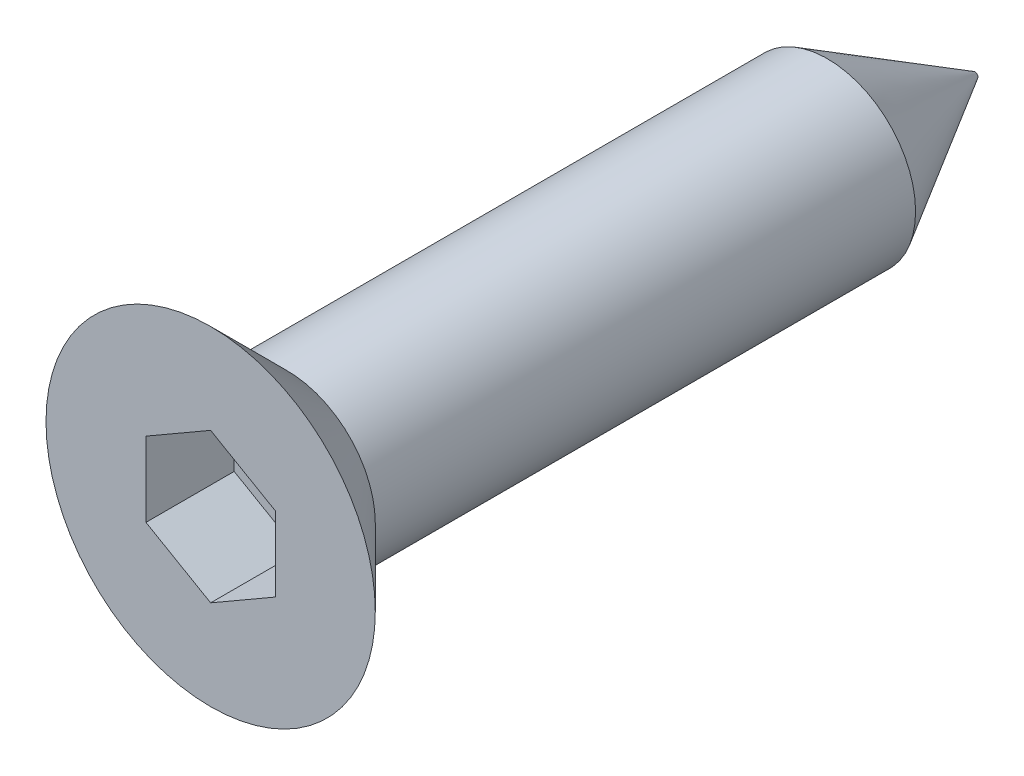
ISO-10303-21;
HEADER;
FILE_DESCRIPTION(('STEP AP214'),'2;1');
FILE_NAME('part.step','',(''),(''),'','','');
FILE_SCHEMA(('AUTOMOTIVE_DESIGN { 1 0 10303 214 1 1 1 1 }'));
ENDSEC;
DATA;
#1=APPLICATION_CONTEXT('core data for automotive mechanical design processes');
#2=APPLICATION_PROTOCOL_DEFINITION('international standard','automotive_design',2000,#1);
#3=PRODUCT_CONTEXT('',#1,'mechanical');
#4=PRODUCT('Part','Part','',(#3));
#5=PRODUCT_RELATED_PRODUCT_CATEGORY('part','',(#4));
#6=PRODUCT_DEFINITION_FORMATION('','',#4);
#7=PRODUCT_DEFINITION_CONTEXT('part definition',#1,'design');
#8=PRODUCT_DEFINITION('design','',#6,#7);
#9=PRODUCT_DEFINITION_SHAPE('','',#8);
#10=(LENGTH_UNIT() NAMED_UNIT(*) SI_UNIT(.MILLI.,.METRE.));
#11=(NAMED_UNIT(*) PLANE_ANGLE_UNIT() SI_UNIT($,.RADIAN.));
#12=(NAMED_UNIT(*) SI_UNIT($,.STERADIAN.) SOLID_ANGLE_UNIT());
#13=UNCERTAINTY_MEASURE_WITH_UNIT(LENGTH_MEASURE(1.E-05),#10,'distance_accuracy_value','');
#14=(GEOMETRIC_REPRESENTATION_CONTEXT(3) GLOBAL_UNCERTAINTY_ASSIGNED_CONTEXT((#13)) GLOBAL_UNIT_ASSIGNED_CONTEXT((#10,
#11,#12)) REPRESENTATION_CONTEXT('',''));
#15=CARTESIAN_POINT('',(0.,0.,0.));
#16=DIRECTION('',(0.,0.,1.));
#17=DIRECTION('',(1.,0.,0.));
#18=AXIS2_PLACEMENT_3D('',#15,#16,#17);
#19=CARTESIAN_POINT('',(0.,2.8,0.));
#20=DIRECTION('',(0.,0.,-1.));
#21=DIRECTION('',(-1.,0.,0.));
#22=AXIS2_PLACEMENT_3D('',#19,#20,#21);
#23=PLANE('',#22);
#24=DIRECTION('',(-0.866025403784439,-0.5,0.));
#25=VECTOR('',#24,1.);
#26=CARTESIAN_POINT('',(0.,1.27017059221718,0.));
#27=LINE('',#26,#25);
#28=CARTESIAN_POINT('',(0.,1.27017059221718,0.));
#29=VERTEX_POINT('',#28);
#30=CARTESIAN_POINT('',(-1.1,0.635085296108588,0.));
#31=VERTEX_POINT('',#30);
#32=EDGE_CURVE('E121',#29,#31,#27,.T.);
#33=ORIENTED_EDGE('',*,*,#32,.F.);
#34=DIRECTION('',(-0.866025403784439,0.5,0.));
#35=VECTOR('',#34,1.);
#36=CARTESIAN_POINT('',(1.1,0.635085296108589,0.));
#37=LINE('',#36,#35);
#38=CARTESIAN_POINT('',(1.1,0.635085296108589,0.));
#39=VERTEX_POINT('',#38);
#40=EDGE_CURVE('E47',#39,#29,#37,.T.);
#41=ORIENTED_EDGE('',*,*,#40,.F.);
#42=DIRECTION('',(0.,1.,0.));
#43=VECTOR('',#42,1.);
#44=CARTESIAN_POINT('',(1.1,-0.635085296108589,0.));
#45=LINE('',#44,#43);
#46=CARTESIAN_POINT('',(1.1,-0.635085296108589,0.));
#47=VERTEX_POINT('',#46);
#48=EDGE_CURVE('E130',#47,#39,#45,.T.);
#49=ORIENTED_EDGE('',*,*,#48,.F.);
#50=DIRECTION('',(0.866025403784438,0.5,0.));
#51=VECTOR('',#50,1.);
#52=CARTESIAN_POINT('',(0.,-1.27017059221718,0.));
#53=LINE('',#52,#51);
#54=CARTESIAN_POINT('',(0.,-1.27017059221718,0.));
#55=VERTEX_POINT('',#54);
#56=EDGE_CURVE('E128',#55,#47,#53,.T.);
#57=ORIENTED_EDGE('',*,*,#56,.F.);
#58=DIRECTION('',(0.866025403784439,-0.5,0.));
#59=VECTOR('',#58,1.);
#60=CARTESIAN_POINT('',(-1.1,-0.635085296108589,0.));
#61=LINE('',#60,#59);
#62=CARTESIAN_POINT('',(-1.1,-0.635085296108589,0.));
#63=VERTEX_POINT('',#62);
#64=EDGE_CURVE('E95',#63,#55,#61,.T.);
#65=ORIENTED_EDGE('',*,*,#64,.F.);
#66=DIRECTION('',(0.,-1.,0.));
#67=VECTOR('',#66,1.);
#68=CARTESIAN_POINT('',(-1.1,0.635085296108588,0.));
#69=LINE('',#68,#67);
#70=EDGE_CURVE('E124',#31,#63,#69,.T.);
#71=ORIENTED_EDGE('',*,*,#70,.F.);
#72=EDGE_LOOP('',(#33,#41,#49,#57,#65,#71));
#73=FACE_BOUND('',#72,.T.);
#74=CARTESIAN_POINT('',(0.,0.,0.));
#75=DIRECTION('',(0.,0.,1.));
#76=DIRECTION('',(1.,0.,0.));
#77=AXIS2_PLACEMENT_3D('',#74,#75,#76);
#78=CIRCLE('',#77,2.8);
#79=CARTESIAN_POINT('',(2.8,0.,0.));
#80=VERTEX_POINT('',#79);
#81=EDGE_CURVE('E142',#80,#80,#78,.T.);
#82=ORIENTED_EDGE('',*,*,#81,.T.);
#83=EDGE_LOOP('',(#82));
#84=FACE_BOUND('',#83,.T.);
#85=ADVANCED_FACE('F32',(#73,#84),#23,.F.);
#86=CARTESIAN_POINT('',(0.,0.,-1.3));
#87=DIRECTION('',(0.,0.,1.));
#88=DIRECTION('',(1.,0.,0.));
#89=AXIS2_PLACEMENT_3D('',#86,#87,#88);
#90=CONICAL_SURFACE('',#89,1.5,0.78539816339745);
#91=ORIENTED_EDGE('',*,*,#81,.F.);
#92=EDGE_LOOP('',(#91));
#93=FACE_BOUND('',#92,.T.);
#94=CARTESIAN_POINT('',(0.,0.,-1.3));
#95=DIRECTION('',(0.,0.,1.));
#96=DIRECTION('',(1.,0.,0.));
#97=AXIS2_PLACEMENT_3D('',#94,#95,#96);
#98=CIRCLE('',#97,1.5);
#99=CARTESIAN_POINT('',(1.5,0.,-1.3));
#100=VERTEX_POINT('',#99);
#101=EDGE_CURVE('E134',#100,#100,#98,.T.);
#102=ORIENTED_EDGE('',*,*,#101,.T.);
#103=EDGE_LOOP('',(#102));
#104=FACE_BOUND('',#103,.T.);
#105=ADVANCED_FACE('F159',(#93,#104),#90,.T.);
#106=CARTESIAN_POINT('',(0.,0.,-13.));
#107=DIRECTION('',(0.,0.,1.));
#108=DIRECTION('',(1.,0.,0.));
#109=AXIS2_PLACEMENT_3D('',#106,#107,#108);
#110=CYLINDRICAL_SURFACE('',#109,1.5);
#111=CARTESIAN_POINT('',(0.,0.,-10.4885263290251));
#112=DIRECTION('',(0.,0.,1.));
#113=DIRECTION('',(1.,0.,0.));
#114=AXIS2_PLACEMENT_3D('',#111,#112,#113);
#115=CIRCLE('',#114,1.5);
#116=CARTESIAN_POINT('',(1.5,0.,-10.4885263290251));
#117=VERTEX_POINT('',#116);
#118=EDGE_CURVE('E40',#117,#117,#115,.T.);
#119=CARTESIAN_POINT('',(1.5,0.,-10.4885263290251));
#120=CARTESIAN_POINT('',(1.5,0.,-10.3928125130978));
#121=CARTESIAN_POINT('',(1.5,0.,-10.2970986971704));
#122=CARTESIAN_POINT('',(1.5,0.,-10.1056710653157));
#123=CARTESIAN_POINT('',(1.5,0.,-10.0099572493884));
#124=CARTESIAN_POINT('',(1.5,0.,-9.81852961753368));
#125=CARTESIAN_POINT('',(1.5,0.,-9.72281580160634));
#126=CARTESIAN_POINT('',(1.5,0.,-9.53138816975165));
#127=CARTESIAN_POINT('',(1.5,0.,-9.4356743538243));
#128=CARTESIAN_POINT('',(1.5,0.,-9.24424672196961));
#129=CARTESIAN_POINT('',(1.5,0.,-9.14853290604227));
#130=CARTESIAN_POINT('',(1.5,0.,-8.95710527418758));
#131=CARTESIAN_POINT('',(1.5,0.,-8.86139145826023));
#132=CARTESIAN_POINT('',(1.5,0.,-8.66996382640555));
#133=CARTESIAN_POINT('',(1.5,0.,-8.5742500104782));
#134=CARTESIAN_POINT('',(1.5,0.,-8.38282237862351));
#135=CARTESIAN_POINT('',(1.5,0.,-8.28710856269617));
#136=CARTESIAN_POINT('',(1.5,0.,-8.09568093084148));
#137=CARTESIAN_POINT('',(1.5,0.,-7.99996711491413));
#138=CARTESIAN_POINT('',(1.5,0.,-7.80853948305944));
#139=CARTESIAN_POINT('',(1.5,0.,-7.7128256671321));
#140=CARTESIAN_POINT('',(1.5,0.,-7.52139803527741));
#141=CARTESIAN_POINT('',(1.5,0.,-7.42568421935006));
#142=CARTESIAN_POINT('',(1.5,0.,-7.23425658749537));
#143=CARTESIAN_POINT('',(1.5,0.,-7.13854277156803));
#144=CARTESIAN_POINT('',(1.5,0.,-6.94711513971334));
#145=CARTESIAN_POINT('',(1.5,0.,-6.85140132378599));
#146=CARTESIAN_POINT('',(1.5,0.,-6.6599736919313));
#147=CARTESIAN_POINT('',(1.5,0.,-6.56425987600396));
#148=CARTESIAN_POINT('',(1.5,0.,-6.37283224414927));
#149=CARTESIAN_POINT('',(1.5,0.,-6.27711842822193));
#150=CARTESIAN_POINT('',(1.5,0.,-6.08569079636724));
#151=CARTESIAN_POINT('',(1.5,0.,-5.98997698043989));
#152=CARTESIAN_POINT('',(1.5,0.,-5.7985493485852));
#153=CARTESIAN_POINT('',(1.5,0.,-5.70283553265786));
#154=CARTESIAN_POINT('',(1.5,0.,-5.51140790080317));
#155=CARTESIAN_POINT('',(1.5,0.,-5.41569408487582));
#156=CARTESIAN_POINT('',(1.5,0.,-5.22426645302113));
#157=CARTESIAN_POINT('',(1.5,0.,-5.12855263709379));
#158=CARTESIAN_POINT('',(1.5,0.,-4.9371250052391));
#159=CARTESIAN_POINT('',(1.5,0.,-4.84141118931175));
#160=CARTESIAN_POINT('',(1.5,0.,-4.64998355745706));
#161=CARTESIAN_POINT('',(1.5,0.,-4.55426974152972));
#162=CARTESIAN_POINT('',(1.5,0.,-4.36284210967503));
#163=CARTESIAN_POINT('',(1.5,0.,-4.26712829374769));
#164=CARTESIAN_POINT('',(1.5,0.,-4.075700661893));
#165=CARTESIAN_POINT('',(1.5,0.,-3.97998684596565));
#166=CARTESIAN_POINT('',(1.5,0.,-3.78855921411096));
#167=CARTESIAN_POINT('',(1.5,0.,-3.69284539818362));
#168=CARTESIAN_POINT('',(1.5,0.,-3.50141776632893));
#169=CARTESIAN_POINT('',(1.5,0.,-3.40570395040158));
#170=CARTESIAN_POINT('',(1.5,0.,-3.21427631854689));
#171=CARTESIAN_POINT('',(1.5,0.,-3.11856250261955));
#172=CARTESIAN_POINT('',(1.5,0.,-2.92713487076486));
#173=CARTESIAN_POINT('',(1.5,0.,-2.83142105483751));
#174=CARTESIAN_POINT('',(1.5,0.,-2.63999342298282));
#175=CARTESIAN_POINT('',(1.5,0.,-2.54427960705548));
#176=CARTESIAN_POINT('',(1.5,0.,-2.35285197520079));
#177=CARTESIAN_POINT('',(1.5,0.,-2.25713815927344));
#178=CARTESIAN_POINT('',(1.5,0.,-2.06571052741875));
#179=CARTESIAN_POINT('',(1.5,0.,-1.96999671149141));
#180=CARTESIAN_POINT('',(1.5,0.,-1.77856907963672));
#181=CARTESIAN_POINT('',(1.5,0.,-1.68285526370938));
#182=CARTESIAN_POINT('',(1.5,0.,-1.49142763185469));
#183=CARTESIAN_POINT('',(1.5,0.,-1.39571381592734));
#184=CARTESIAN_POINT('',(1.5,0.,-1.3));
#185=B_SPLINE_CURVE_WITH_KNOTS('',3,(#119,#120,#121,#122,#123,#124,#125,#126,#127,#128,#129,
#130,#131,#132,#133,#134,#135,#136,#137,#138,#139,#140,#141,#142,#143,#144,#145,#146,#147,#148,
#149,#150,#151,#152,#153,#154,#155,#156,#157,#158,#159,#160,#161,#162,#163,#164,#165,#166,#167,
#168,#169,#170,#171,#172,#173,#174,#175,#176,#177,#178,#179,#180,#181,#182,#183,#184),
.UNSPECIFIED.,.F.,.F.,(4,2,2,2,2,2,2,2,2,2,2,2,2,2,2,2,2,2,2,2,2,2,2,2,2,2,2,2,2,2,2,2,4),(0.,
0.287141447782033,0.574282895564068,0.861424343346103,1.14856579112814,1.43570723891017,
1.72284868669221,2.00999013447424,2.29713158225627,2.58427303003831,2.87141447782034,
3.15855592560238,3.44569737338441,3.73283882116645,4.01998026894848,4.30712171673051,
4.59426316451255,4.88140461229458,5.16854606007662,5.45568750785865,5.74282895564069,
6.02997040342272,6.31711185120475,6.60425329898679,6.89139474676882,7.17853619455086,
7.46567764233289,7.75281909011493,8.03996053789696,8.327101985679,8.61424343346103,
8.90138488124306,9.1885263290251),.UNSPECIFIED.);
#186=EDGE_CURVE('BSEAM147',#117,#100,#185,.T.);
#187=ORIENTED_EDGE('',*,*,#118,.T.);
#188=ORIENTED_EDGE('',*,*,#101,.F.);
#189=ORIENTED_EDGE('',*,*,#186,.T.);
#190=ORIENTED_EDGE('',*,*,#186,.F.);
#191=EDGE_LOOP('',(#187,#189,#188,#190));
#192=FACE_BOUND('',#191,.T.);
#193=ADVANCED_FACE('F147',(#192),#110,.T.);
#194=CARTESIAN_POINT('',(0.,0.,-13.));
#195=DIRECTION('',(0.,0.,1.));
#196=DIRECTION('',(1.,0.,0.));
#197=AXIS2_PLACEMENT_3D('',#194,#195,#196);
#198=PLANE('',#197);
#199=CARTESIAN_POINT('',(0.,0.,-13.));
#200=DIRECTION('',(0.,0.,1.));
#201=DIRECTION('',(1.,0.,0.));
#202=AXIS2_PLACEMENT_3D('',#199,#200,#201);
#203=CIRCLE('',#202,0.0499999999999917);
#204=CARTESIAN_POINT('',(0.0499999999999912,0.,-13.));
#205=VERTEX_POINT('',#204);
#206=EDGE_CURVE('E11',#205,#205,#203,.F.);
#207=ORIENTED_EDGE('',*,*,#206,.T.);
#208=EDGE_LOOP('',(#207));
#209=FACE_BOUND('',#208,.T.);
#210=ADVANCED_FACE('F171',(#209),#198,.F.);
#211=CARTESIAN_POINT('',(1.1,0.635085296108589,-1.5));
#212=DIRECTION('',(0.5,0.866025403784439,0.));
#213=DIRECTION('',(-0.866025403784439,0.5,0.));
#214=AXIS2_PLACEMENT_3D('',#211,#212,#213);
#215=PLANE('',#214);
#216=ORIENTED_EDGE('',*,*,#40,.T.);
#217=DIRECTION('',(0.,0.,1.));
#218=VECTOR('',#217,1.);
#219=CARTESIAN_POINT('',(0.,1.27017059221718,-1.5));
#220=LINE('',#219,#218);
#221=CARTESIAN_POINT('',(0.,1.27017059221718,-1.5));
#222=VERTEX_POINT('',#221);
#223=EDGE_CURVE('E77',#222,#29,#220,.T.);
#224=ORIENTED_EDGE('',*,*,#223,.F.);
#225=DIRECTION('',(-0.866025403784439,0.5,0.));
#226=VECTOR('',#225,1.);
#227=CARTESIAN_POINT('',(1.1,0.635085296108589,-1.5));
#228=LINE('',#227,#226);
#229=CARTESIAN_POINT('',(1.1,0.635085296108589,-1.5));
#230=VERTEX_POINT('',#229);
#231=EDGE_CURVE('E132',#230,#222,#228,.T.);
#232=ORIENTED_EDGE('',*,*,#231,.F.);
#233=DIRECTION('',(0.,0.,1.));
#234=VECTOR('',#233,1.);
#235=CARTESIAN_POINT('',(1.1,0.635085296108589,-1.5));
#236=LINE('',#235,#234);
#237=EDGE_CURVE('E55',#230,#39,#236,.T.);
#238=ORIENTED_EDGE('',*,*,#237,.T.);
#239=EDGE_LOOP('',(#216,#224,#232,#238));
#240=FACE_BOUND('',#239,.T.);
#241=ADVANCED_FACE('F174',(#240),#215,.F.);
#242=CARTESIAN_POINT('',(1.1,-0.635085296108589,-1.5));
#243=DIRECTION('',(1.,0.,0.));
#244=DIRECTION('',(0.,1.,0.));
#245=AXIS2_PLACEMENT_3D('',#242,#243,#244);
#246=PLANE('',#245);
#247=ORIENTED_EDGE('',*,*,#48,.T.);
#248=ORIENTED_EDGE('',*,*,#237,.F.);
#249=DIRECTION('',(0.,1.,0.));
#250=VECTOR('',#249,1.);
#251=CARTESIAN_POINT('',(1.1,-0.635085296108589,-1.5));
#252=LINE('',#251,#250);
#253=CARTESIAN_POINT('',(1.1,-0.635085296108589,-1.5));
#254=VERTEX_POINT('',#253);
#255=EDGE_CURVE('E107',#254,#230,#252,.T.);
#256=ORIENTED_EDGE('',*,*,#255,.F.);
#257=DIRECTION('',(0.,0.,1.));
#258=VECTOR('',#257,1.);
#259=CARTESIAN_POINT('',(1.1,-0.635085296108589,-1.5));
#260=LINE('',#259,#258);
#261=EDGE_CURVE('E99',#254,#47,#260,.T.);
#262=ORIENTED_EDGE('',*,*,#261,.T.);
#263=EDGE_LOOP('',(#247,#248,#256,#262));
#264=FACE_BOUND('',#263,.T.);
#265=ADVANCED_FACE('F178',(#264),#246,.F.);
#266=CARTESIAN_POINT('',(0.,-1.27017059221718,-1.5));
#267=DIRECTION('',(0.5,-0.866025403784439,0.));
#268=DIRECTION('',(0.866025403784439,0.5,0.));
#269=AXIS2_PLACEMENT_3D('',#266,#267,#268);
#270=PLANE('',#269);
#271=ORIENTED_EDGE('',*,*,#56,.T.);
#272=ORIENTED_EDGE('',*,*,#261,.F.);
#273=DIRECTION('',(0.866025403784438,0.5,0.));
#274=VECTOR('',#273,1.);
#275=CARTESIAN_POINT('',(0.,-1.27017059221718,-1.5));
#276=LINE('',#275,#274);
#277=CARTESIAN_POINT('',(0.,-1.27017059221718,-1.5));
#278=VERTEX_POINT('',#277);
#279=EDGE_CURVE('E103',#278,#254,#276,.T.);
#280=ORIENTED_EDGE('',*,*,#279,.F.);
#281=DIRECTION('',(0.,0.,1.));
#282=VECTOR('',#281,1.);
#283=CARTESIAN_POINT('',(0.,-1.27017059221718,-1.5));
#284=LINE('',#283,#282);
#285=EDGE_CURVE('E88',#278,#55,#284,.T.);
#286=ORIENTED_EDGE('',*,*,#285,.T.);
#287=EDGE_LOOP('',(#271,#272,#280,#286));
#288=FACE_BOUND('',#287,.T.);
#289=ADVANCED_FACE('F104',(#288),#270,.F.);
#290=CARTESIAN_POINT('',(-1.1,-0.635085296108589,-1.5));
#291=DIRECTION('',(-0.5,-0.866025403784439,0.));
#292=DIRECTION('',(0.866025403784439,-0.5,0.));
#293=AXIS2_PLACEMENT_3D('',#290,#291,#292);
#294=PLANE('',#293);
#295=ORIENTED_EDGE('',*,*,#64,.T.);
#296=ORIENTED_EDGE('',*,*,#285,.F.);
#297=DIRECTION('',(0.866025403784439,-0.5,0.));
#298=VECTOR('',#297,1.);
#299=CARTESIAN_POINT('',(-1.1,-0.635085296108589,-1.5));
#300=LINE('',#299,#298);
#301=CARTESIAN_POINT('',(-1.1,-0.635085296108589,-1.5));
#302=VERTEX_POINT('',#301);
#303=EDGE_CURVE('E92',#302,#278,#300,.T.);
#304=ORIENTED_EDGE('',*,*,#303,.F.);
#305=DIRECTION('',(0.,0.,1.));
#306=VECTOR('',#305,1.);
#307=CARTESIAN_POINT('',(-1.1,-0.635085296108589,-1.5));
#308=LINE('',#307,#306);
#309=EDGE_CURVE('E100',#302,#63,#308,.T.);
#310=ORIENTED_EDGE('',*,*,#309,.T.);
#311=EDGE_LOOP('',(#295,#296,#304,#310));
#312=FACE_BOUND('',#311,.T.);
#313=ADVANCED_FACE('F90',(#312),#294,.F.);
#314=CARTESIAN_POINT('',(-1.1,0.635085296108588,-1.5));
#315=DIRECTION('',(-1.,0.,0.));
#316=DIRECTION('',(0.,-1.,0.));
#317=AXIS2_PLACEMENT_3D('',#314,#315,#316);
#318=PLANE('',#317);
#319=ORIENTED_EDGE('',*,*,#70,.T.);
#320=ORIENTED_EDGE('',*,*,#309,.F.);
#321=DIRECTION('',(0.,-1.,0.));
#322=VECTOR('',#321,1.);
#323=CARTESIAN_POINT('',(-1.1,0.635085296108588,-1.5));
#324=LINE('',#323,#322);
#325=CARTESIAN_POINT('',(-1.1,0.635085296108588,-1.5));
#326=VERTEX_POINT('',#325);
#327=EDGE_CURVE('E113',#326,#302,#324,.T.);
#328=ORIENTED_EDGE('',*,*,#327,.F.);
#329=DIRECTION('',(0.,0.,1.));
#330=VECTOR('',#329,1.);
#331=CARTESIAN_POINT('',(-1.1,0.635085296108588,-1.5));
#332=LINE('',#331,#330);
#333=EDGE_CURVE('E137',#326,#31,#332,.T.);
#334=ORIENTED_EDGE('',*,*,#333,.T.);
#335=EDGE_LOOP('',(#319,#320,#328,#334));
#336=FACE_BOUND('',#335,.T.);
#337=ADVANCED_FACE('F181',(#336),#318,.F.);
#338=CARTESIAN_POINT('',(0.,1.27017059221718,-1.5));
#339=DIRECTION('',(-0.5,0.866025403784439,0.));
#340=DIRECTION('',(-0.866025403784439,-0.5,0.));
#341=AXIS2_PLACEMENT_3D('',#338,#339,#340);
#342=PLANE('',#341);
#343=ORIENTED_EDGE('',*,*,#32,.T.);
#344=ORIENTED_EDGE('',*,*,#333,.F.);
#345=DIRECTION('',(-0.866025403784439,-0.5,0.));
#346=VECTOR('',#345,1.);
#347=CARTESIAN_POINT('',(0.,1.27017059221718,-1.5));
#348=LINE('',#347,#346);
#349=EDGE_CURVE('E115',#222,#326,#348,.T.);
#350=ORIENTED_EDGE('',*,*,#349,.F.);
#351=ORIENTED_EDGE('',*,*,#223,.T.);
#352=EDGE_LOOP('',(#343,#344,#350,#351));
#353=FACE_BOUND('',#352,.T.);
#354=ADVANCED_FACE('F155',(#353),#342,.F.);
#355=CARTESIAN_POINT('',(-1.1,1.90525588832577,-1.5));
#356=DIRECTION('',(0.,0.,1.));
#357=DIRECTION('',(1.,0.,0.));
#358=AXIS2_PLACEMENT_3D('',#355,#356,#357);
#359=PLANE('',#358);
#360=ORIENTED_EDGE('',*,*,#231,.T.);
#361=ORIENTED_EDGE('',*,*,#349,.T.);
#362=ORIENTED_EDGE('',*,*,#327,.T.);
#363=ORIENTED_EDGE('',*,*,#303,.T.);
#364=ORIENTED_EDGE('',*,*,#279,.T.);
#365=ORIENTED_EDGE('',*,*,#255,.T.);
#366=EDGE_LOOP('',(#360,#361,#362,#363,#364,#365));
#367=FACE_BOUND('',#366,.T.);
#368=ADVANCED_FACE('F110',(#367),#359,.T.);
#369=CARTESIAN_POINT('',(0.,0.,-10.4885263290251));
#370=DIRECTION('',(0.,0.,1.));
#371=DIRECTION('',(1.,0.,0.));
#372=AXIS2_PLACEMENT_3D('',#369,#370,#371);
#373=CONICAL_SURFACE('',#372,1.5,0.523598775598296);
#374=CARTESIAN_POINT('',(0.0499999999999912,0.,-13.));
#375=CARTESIAN_POINT('',(0.0651041666666582,0.,-12.9738388159273));
#376=CARTESIAN_POINT('',(0.0802083333333248,0.,-12.9476776318547));
#377=CARTESIAN_POINT('',(0.110416666666658,0.,-12.8953552637094));
#378=CARTESIAN_POINT('',(0.125520833333325,0.,-12.8691940796367));
#379=CARTESIAN_POINT('',(0.155729166666658,0.,-12.8168717114914));
#380=CARTESIAN_POINT('',(0.170833333333325,0.,-12.7907105274188));
#381=CARTESIAN_POINT('',(0.201041666666659,0.,-12.7383881592734));
#382=CARTESIAN_POINT('',(0.216145833333325,0.,-12.7122269752008));
#383=CARTESIAN_POINT('',(0.246354166666659,0.,-12.6599046070555));
#384=CARTESIAN_POINT('',(0.261458333333326,0.,-12.6337434229828));
#385=CARTESIAN_POINT('',(0.291666666666659,0.,-12.5814210548375));
#386=CARTESIAN_POINT('',(0.306770833333326,0.,-12.5552598707649));
#387=CARTESIAN_POINT('',(0.33697916666666,0.,-12.5029375026196));
#388=CARTESIAN_POINT('',(0.352083333333326,0.,-12.4767763185469));
#389=CARTESIAN_POINT('',(0.38229166666666,0.,-12.4244539504016));
#390=CARTESIAN_POINT('',(0.397395833333327,0.,-12.3982927663289));
#391=CARTESIAN_POINT('',(0.42760416666666,0.,-12.3459703981836));
#392=CARTESIAN_POINT('',(0.442708333333327,0.,-12.319809214111));
#393=CARTESIAN_POINT('',(0.47291666666666,0.,-12.2674868459657));
#394=CARTESIAN_POINT('',(0.488020833333327,0.,-12.241325661893));
#395=CARTESIAN_POINT('',(0.518229166666661,0.,-12.1890032937477));
#396=CARTESIAN_POINT('',(0.533333333333327,0.,-12.162842109675));
#397=CARTESIAN_POINT('',(0.563541666666661,0.,-12.1105197415297));
#398=CARTESIAN_POINT('',(0.578645833333328,0.,-12.0843585574571));
#399=CARTESIAN_POINT('',(0.608854166666661,0.,-12.0320361893118));
#400=CARTESIAN_POINT('',(0.623958333333328,0.,-12.0058750052391));
#401=CARTESIAN_POINT('',(0.654166666666661,0.,-11.9535526370938));
#402=CARTESIAN_POINT('',(0.669270833333328,0.,-11.9273914530211));
#403=CARTESIAN_POINT('',(0.699479166666662,0.,-11.8750690848758));
#404=CARTESIAN_POINT('',(0.714583333333329,0.,-11.8489079008032));
#405=CARTESIAN_POINT('',(0.744791666666662,0.,-11.7965855326579));
#406=CARTESIAN_POINT('',(0.759895833333329,0.,-11.7704243485852));
#407=CARTESIAN_POINT('',(0.790104166666662,0.,-11.7181019804399));
#408=CARTESIAN_POINT('',(0.805208333333329,0.,-11.6919407963672));
#409=CARTESIAN_POINT('',(0.835416666666663,0.,-11.6396184282219));
#410=CARTESIAN_POINT('',(0.850520833333329,0.,-11.6134572441493));
#411=CARTESIAN_POINT('',(0.880729166666663,0.,-11.561134876004));
#412=CARTESIAN_POINT('',(0.89583333333333,0.,-11.5349736919313));
#413=CARTESIAN_POINT('',(0.926041666666663,0.,-11.482651323786));
#414=CARTESIAN_POINT('',(0.94114583333333,0.,-11.4564901397133));
#415=CARTESIAN_POINT('',(0.971354166666663,0.,-11.404167771568));
#416=CARTESIAN_POINT('',(0.98645833333333,0.,-11.3780065874954));
#417=CARTESIAN_POINT('',(1.01666666666666,0.,-11.3256842193501));
#418=CARTESIAN_POINT('',(1.03177083333333,0.,-11.2995230352774));
#419=CARTESIAN_POINT('',(1.06197916666666,0.,-11.2472006671321));
#420=CARTESIAN_POINT('',(1.07708333333333,0.,-11.2210394830594));
#421=CARTESIAN_POINT('',(1.10729166666666,0.,-11.1687171149141));
#422=CARTESIAN_POINT('',(1.12239583333333,0.,-11.1425559308415));
#423=CARTESIAN_POINT('',(1.15260416666666,0.,-11.0902335626962));
#424=CARTESIAN_POINT('',(1.16770833333333,0.,-11.0640723786235));
#425=CARTESIAN_POINT('',(1.19791666666666,0.,-11.0117500104782));
#426=CARTESIAN_POINT('',(1.21302083333333,0.,-10.9855888264055));
#427=CARTESIAN_POINT('',(1.24322916666667,0.,-10.9332664582602));
#428=CARTESIAN_POINT('',(1.25833333333333,0.,-10.9071052741876));
#429=CARTESIAN_POINT('',(1.28854166666667,0.,-10.8547829060423));
#430=CARTESIAN_POINT('',(1.30364583333333,0.,-10.8286217219696));
#431=CARTESIAN_POINT('',(1.33385416666667,0.,-10.7762993538243));
#432=CARTESIAN_POINT('',(1.34895833333333,0.,-10.7501381697516));
#433=CARTESIAN_POINT('',(1.37916666666667,0.,-10.6978158016063));
#434=CARTESIAN_POINT('',(1.39427083333333,0.,-10.6716546175337));
#435=CARTESIAN_POINT('',(1.42447916666667,0.,-10.6193322493884));
#436=CARTESIAN_POINT('',(1.43958333333333,0.,-10.5931710653157));
#437=CARTESIAN_POINT('',(1.46979166666667,0.,-10.5408486971704));
#438=CARTESIAN_POINT('',(1.48489583333333,0.,-10.5146875130978));
#439=CARTESIAN_POINT('',(1.5,0.,-10.4885263290251));
#440=B_SPLINE_CURVE_WITH_KNOTS('',3,(#374,#375,#376,#377,#378,#379,#380,#381,#382,#383,#384,
#385,#386,#387,#388,#389,#390,#391,#392,#393,#394,#395,#396,#397,#398,#399,#400,#401,#402,#403,
#404,#405,#406,#407,#408,#409,#410,#411,#412,#413,#414,#415,#416,#417,#418,#419,#420,#421,#422,
#423,#424,#425,#426,#427,#428,#429,#430,#431,#432,#433,#434,#435,#436,#437,#438,#439),
.UNSPECIFIED.,.F.,.F.,(4,2,2,2,2,2,2,2,2,2,2,2,2,2,2,2,2,2,2,2,2,2,2,2,2,2,2,2,2,2,2,2,4),(0.,
0.0906250000000016,0.181250000000003,0.271875000000004,0.362500000000005,0.453125000000005,
0.543750000000007,0.634375000000009,0.725000000000009,0.815625000000009,0.906250000000011,
0.996875000000012,1.08750000000001,1.17812500000001,1.26875000000001,1.35937500000002,
1.45000000000002,1.54062500000002,1.63125000000002,1.72187500000002,1.81250000000002,
1.90312500000002,1.99375000000002,2.08437500000002,2.17500000000003,2.26562500000003,
2.35625000000003,2.44687500000003,2.53750000000003,2.62812500000003,2.71875000000003,
2.80937500000003,2.90000000000003),.UNSPECIFIED.);
#441=EDGE_CURVE('BSEAM34',#205,#117,#440,.T.);
#442=ORIENTED_EDGE('',*,*,#206,.F.);
#443=ORIENTED_EDGE('',*,*,#118,.F.);
#444=ORIENTED_EDGE('',*,*,#441,.T.);
#445=ORIENTED_EDGE('',*,*,#441,.F.);
#446=EDGE_LOOP('',(#442,#444,#443,#445));
#447=FACE_BOUND('',#446,.T.);
#448=ADVANCED_FACE('F34',(#447),#373,.T.);
#449=CLOSED_SHELL('',(#85,#105,#193,#210,#241,#265,#289,#313,#337,#354,#368,#448));
#450=MANIFOLD_SOLID_BREP('B2',#449);
#451=ADVANCED_BREP_SHAPE_REPRESENTATION('',(#18,#450),#14);
#452=SHAPE_DEFINITION_REPRESENTATION(#9,#451);
ENDSEC;
END-ISO-10303-21;
